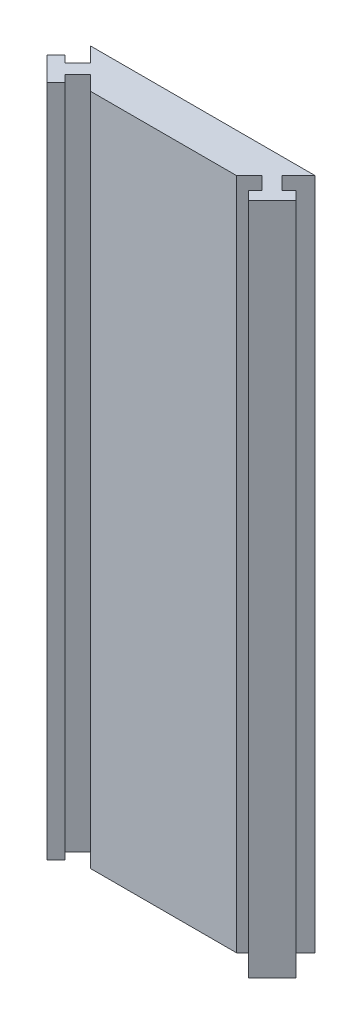
ISO-10303-21;
HEADER;
FILE_DESCRIPTION(('STEP AP214'),'2;1');
FILE_NAME('part.step','',(''),(''),'','','');
FILE_SCHEMA(('AUTOMOTIVE_DESIGN { 1 0 10303 214 1 1 1 1 }'));
ENDSEC;
DATA;
#1=APPLICATION_CONTEXT('core data for automotive mechanical design processes');
#2=APPLICATION_PROTOCOL_DEFINITION('international standard','automotive_design',2000,#1);
#3=PRODUCT_CONTEXT('',#1,'mechanical');
#4=PRODUCT('Part','Part','',(#3));
#5=PRODUCT_RELATED_PRODUCT_CATEGORY('part','',(#4));
#6=PRODUCT_DEFINITION_FORMATION('','',#4);
#7=PRODUCT_DEFINITION_CONTEXT('part definition',#1,'design');
#8=PRODUCT_DEFINITION('design','',#6,#7);
#9=PRODUCT_DEFINITION_SHAPE('','',#8);
#10=(LENGTH_UNIT() NAMED_UNIT(*) SI_UNIT(.MILLI.,.METRE.));
#11=(NAMED_UNIT(*) PLANE_ANGLE_UNIT() SI_UNIT($,.RADIAN.));
#12=(NAMED_UNIT(*) SI_UNIT($,.STERADIAN.) SOLID_ANGLE_UNIT());
#13=UNCERTAINTY_MEASURE_WITH_UNIT(LENGTH_MEASURE(1.E-05),#10,'distance_accuracy_value','');
#14=(GEOMETRIC_REPRESENTATION_CONTEXT(3) GLOBAL_UNCERTAINTY_ASSIGNED_CONTEXT((#13)) GLOBAL_UNIT_ASSIGNED_CONTEXT((#10,
#11,#12)) REPRESENTATION_CONTEXT('',''));
#15=CARTESIAN_POINT('',(0.,0.,0.));
#16=DIRECTION('',(0.,0.,1.));
#17=DIRECTION('',(1.,0.,0.));
#18=AXIS2_PLACEMENT_3D('',#15,#16,#17);
#19=CARTESIAN_POINT('',(-12.4677279807285,0.,10.0274908996884));
#20=DIRECTION('',(-0.707106781186551,0.,-0.707106781186544));
#21=DIRECTION('',(-0.707106781186544,0.,0.707106781186551));
#22=AXIS2_PLACEMENT_3D('',#19,#20,#21);
#23=PLANE('',#22);
#24=DIRECTION('',(0.,1.,0.));
#25=VECTOR('',#24,1.);
#26=CARTESIAN_POINT('',(-15.4046060400008,0.,12.9643689589607));
#27=LINE('',#26,#25);
#28=CARTESIAN_POINT('',(-15.4046060400008,0.,12.9643689589607));
#29=VERTEX_POINT('',#28);
#30=CARTESIAN_POINT('',(-15.4046060400008,120.,12.9643689589607));
#31=VERTEX_POINT('',#30);
#32=EDGE_CURVE('E267',#29,#31,#27,.T.);
#33=ORIENTED_EDGE('',*,*,#32,.F.);
#34=DIRECTION('',(-0.707106781186544,0.,0.707106781186551));
#35=VECTOR('',#34,1.);
#36=CARTESIAN_POINT('',(-12.4677279807285,0.,10.0274908996884));
#37=LINE('',#36,#35);
#38=CARTESIAN_POINT('',(-12.4677279807285,0.,10.0274908996884));
#39=VERTEX_POINT('',#38);
#40=EDGE_CURVE('E194',#39,#29,#37,.T.);
#41=ORIENTED_EDGE('',*,*,#40,.F.);
#42=DIRECTION('',(0.,-1.,0.));
#43=VECTOR('',#42,1.);
#44=CARTESIAN_POINT('',(-12.4677279807285,120.,10.0274908996884));
#45=LINE('',#44,#43);
#46=CARTESIAN_POINT('',(-12.4677279807285,120.,10.0274908996884));
#47=VERTEX_POINT('',#46);
#48=EDGE_CURVE('E11',#47,#39,#45,.T.);
#49=ORIENTED_EDGE('',*,*,#48,.F.);
#50=DIRECTION('',(-0.707106781186544,0.,0.707106781186551));
#51=VECTOR('',#50,1.);
#52=CARTESIAN_POINT('',(-12.4677279807285,120.,10.0274908996884));
#53=LINE('',#52,#51);
#54=EDGE_CURVE('E195',#47,#31,#53,.T.);
#55=ORIENTED_EDGE('',*,*,#54,.T.);
#56=EDGE_LOOP('',(#33,#41,#49,#55));
#57=FACE_BOUND('',#56,.T.);
#58=ADVANCED_FACE('F33',(#57),#23,.F.);
#59=CARTESIAN_POINT('',(-52.4677279807284,0.,10.0274908996884));
#60=DIRECTION('',(0.707106781186541,0.,-0.707106781186554));
#61=DIRECTION('',(-0.707106781186554,0.,-0.707106781186541));
#62=AXIS2_PLACEMENT_3D('',#59,#60,#61);
#63=PLANE('',#62);
#64=DIRECTION('',(0.,1.,0.));
#65=VECTOR('',#64,1.);
#66=CARTESIAN_POINT('',(-48.0483105983125,0.,14.4469082821042));
#67=LINE('',#66,#65);
#68=CARTESIAN_POINT('',(-48.0483105983125,0.,14.4469082821042));
#69=VERTEX_POINT('',#68);
#70=CARTESIAN_POINT('',(-48.0483105983125,120.,14.4469082821042));
#71=VERTEX_POINT('',#70);
#72=EDGE_CURVE('E281',#69,#71,#67,.T.);
#73=ORIENTED_EDGE('',*,*,#72,.F.);
#74=DIRECTION('',(-0.707106781186554,0.,-0.707106781186541));
#75=VECTOR('',#74,1.);
#76=CARTESIAN_POINT('',(-52.4677279807284,0.,10.0274908996884));
#77=LINE('',#76,#75);
#78=CARTESIAN_POINT('',(-45.4677279807283,0.,17.0274908996884));
#79=VERTEX_POINT('',#78);
#80=EDGE_CURVE('E206',#79,#69,#77,.T.);
#81=ORIENTED_EDGE('',*,*,#80,.F.);
#82=DIRECTION('',(0.,1.,0.));
#83=VECTOR('',#82,1.);
#84=CARTESIAN_POINT('',(-45.4677279807283,0.,17.0274908996884));
#85=LINE('',#84,#83);
#86=CARTESIAN_POINT('',(-45.4677279807283,120.,17.0274908996884));
#87=VERTEX_POINT('',#86);
#88=EDGE_CURVE('E209',#79,#87,#85,.T.);
#89=ORIENTED_EDGE('',*,*,#88,.T.);
#90=DIRECTION('',(-0.707106781186554,0.,-0.707106781186541));
#91=VECTOR('',#90,1.);
#92=CARTESIAN_POINT('',(-52.4677279807284,120.,10.0274908996884));
#93=LINE('',#92,#91);
#94=EDGE_CURVE('E211',#87,#71,#93,.T.);
#95=ORIENTED_EDGE('',*,*,#94,.T.);
#96=EDGE_LOOP('',(#73,#81,#89,#95));
#97=FACE_BOUND('',#96,.T.);
#98=ADVANCED_FACE('F372',(#97),#63,.F.);
#99=CARTESIAN_POINT('',(-52.4677279807284,120.,17.0274908996884));
#100=DIRECTION('',(0.,0.,-1.));
#101=DIRECTION('',(-1.,0.,0.));
#102=AXIS2_PLACEMENT_3D('',#99,#100,#101);
#103=PLANE('',#102);
#104=DIRECTION('',(1.,0.,0.));
#105=VECTOR('',#104,1.);
#106=CARTESIAN_POINT('',(-52.4677279807284,0.,17.0274908996884));
#107=LINE('',#106,#105);
#108=CARTESIAN_POINT('',(-19.4677279807284,0.,17.0274908996884));
#109=VERTEX_POINT('',#108);
#110=EDGE_CURVE('E215',#79,#109,#107,.T.);
#111=ORIENTED_EDGE('',*,*,#110,.T.);
#112=DIRECTION('',(0.,1.,0.));
#113=VECTOR('',#112,1.);
#114=CARTESIAN_POINT('',(-19.4677279807284,0.,17.0274908996884));
#115=LINE('',#114,#113);
#116=CARTESIAN_POINT('',(-19.4677279807284,120.,17.0274908996884));
#117=VERTEX_POINT('',#116);
#118=EDGE_CURVE('E192',#109,#117,#115,.T.);
#119=ORIENTED_EDGE('',*,*,#118,.T.);
#120=DIRECTION('',(1.,0.,0.));
#121=VECTOR('',#120,1.);
#122=CARTESIAN_POINT('',(-52.4677279807284,120.,17.0274908996884));
#123=LINE('',#122,#121);
#124=EDGE_CURVE('E216',#87,#117,#123,.T.);
#125=ORIENTED_EDGE('',*,*,#124,.F.);
#126=ORIENTED_EDGE('',*,*,#88,.F.);
#127=EDGE_LOOP('',(#111,#119,#125,#126));
#128=FACE_BOUND('',#127,.T.);
#129=ADVANCED_FACE('F35',(#128),#103,.F.);
#130=CARTESIAN_POINT('',(-52.4677279807284,120.,10.0274908996884));
#131=DIRECTION('',(0.,0.,1.));
#132=DIRECTION('',(1.,0.,0.));
#133=AXIS2_PLACEMENT_3D('',#130,#131,#132);
#134=PLANE('',#133);
#135=DIRECTION('',(-1.,0.,0.));
#136=VECTOR('',#135,1.);
#137=CARTESIAN_POINT('',(-52.4677279807284,0.,10.0274908996884));
#138=LINE('',#137,#136);
#139=CARTESIAN_POINT('',(-52.4677279807284,0.,10.0274908996884));
#140=VERTEX_POINT('',#139);
#141=EDGE_CURVE('E220',#39,#140,#138,.T.);
#142=ORIENTED_EDGE('',*,*,#141,.T.);
#143=DIRECTION('',(0.,-1.,0.));
#144=VECTOR('',#143,1.);
#145=CARTESIAN_POINT('',(-52.4677279807284,120.,10.0274908996884));
#146=LINE('',#145,#144);
#147=CARTESIAN_POINT('',(-52.4677279807284,120.,10.0274908996884));
#148=VERTEX_POINT('',#147);
#149=EDGE_CURVE('E41',#148,#140,#146,.T.);
#150=ORIENTED_EDGE('',*,*,#149,.F.);
#151=DIRECTION('',(-1.,0.,0.));
#152=VECTOR('',#151,1.);
#153=CARTESIAN_POINT('',(-52.4677279807284,120.,10.0274908996884));
#154=LINE('',#153,#152);
#155=EDGE_CURVE('E219',#47,#148,#154,.T.);
#156=ORIENTED_EDGE('',*,*,#155,.F.);
#157=ORIENTED_EDGE('',*,*,#48,.T.);
#158=EDGE_LOOP('',(#142,#150,#156,#157));
#159=FACE_BOUND('',#158,.T.);
#160=ADVANCED_FACE('F234',(#159),#134,.F.);
#161=CARTESIAN_POINT('',(0.,120.,0.));
#162=DIRECTION('',(0.,-1.,0.));
#163=DIRECTION('',(0.,0.,-1.));
#164=AXIS2_PLACEMENT_3D('',#161,#162,#163);
#165=PLANE('',#164);
#166=ORIENTED_EDGE('',*,*,#124,.T.);
#167=CARTESIAN_POINT('',(-17.1723729929671,120.,14.7321359119271));
#168=VERTEX_POINT('',#167);
#169=EDGE_CURVE('E198',#168,#117,#53,.T.);
#170=ORIENTED_EDGE('',*,*,#169,.F.);
#171=DIRECTION('',(0.707106781186548,0.,0.707106781186547));
#172=VECTOR('',#171,1.);
#173=CARTESIAN_POINT('',(-17.1723729929671,120.,14.7321359119271));
#174=LINE('',#173,#172);
#175=CARTESIAN_POINT('',(-14.8742759541108,120.,17.0302329507833));
#176=VERTEX_POINT('',#175);
#177=EDGE_CURVE('E48',#168,#176,#174,.T.);
#178=ORIENTED_EDGE('',*,*,#177,.T.);
#179=DIRECTION('',(-0.707106781186546,0.,0.707106781186549));
#180=VECTOR('',#179,1.);
#181=CARTESIAN_POINT('',(-14.8742759541108,120.,17.0302329507833));
#182=LINE('',#181,#180);
#183=CARTESIAN_POINT('',(-16.1117128211873,120.,18.2676698178598));
#184=VERTEX_POINT('',#183);
#185=EDGE_CURVE('E319',#176,#184,#182,.T.);
#186=ORIENTED_EDGE('',*,*,#185,.T.);
#187=DIRECTION('',(0.707106781186548,0.,0.707106781186547));
#188=VECTOR('',#187,1.);
#189=CARTESIAN_POINT('',(-16.1117128211873,120.,18.2676698178598));
#190=LINE('',#189,#188);
#191=CARTESIAN_POINT('',(-14.5207225635176,120.,19.8586600755295));
#192=VERTEX_POINT('',#191);
#193=EDGE_CURVE('E323',#184,#192,#190,.T.);
#194=ORIENTED_EDGE('',*,*,#193,.T.);
#195=DIRECTION('',(0.707106781186548,0.,-0.707106781186547));
#196=VECTOR('',#195,1.);
#197=CARTESIAN_POINT('',(-14.5207225635176,120.,19.8586600755295));
#198=LINE('',#197,#196);
#199=CARTESIAN_POINT('',(-10.2780818763983,120.,15.6160193884102));
#200=VERTEX_POINT('',#199);
#201=EDGE_CURVE('E330',#192,#200,#198,.T.);
#202=ORIENTED_EDGE('',*,*,#201,.T.);
#203=DIRECTION('',(-0.707106781186548,0.,-0.707106781186548));
#204=VECTOR('',#203,1.);
#205=CARTESIAN_POINT('',(-10.2780818763983,120.,15.6160193884102));
#206=LINE('',#205,#204);
#207=CARTESIAN_POINT('',(-11.869072134068,120.,14.0250291307405));
#208=VERTEX_POINT('',#207);
#209=EDGE_CURVE('E333',#200,#208,#206,.T.);
#210=ORIENTED_EDGE('',*,*,#209,.T.);
#211=DIRECTION('',(-0.707106781186547,0.,0.707106781186548));
#212=VECTOR('',#211,1.);
#213=CARTESIAN_POINT('',(-11.869072134068,120.,14.0250291307405));
#214=LINE('',#213,#212);
#215=CARTESIAN_POINT('',(-13.1065090011445,120.,15.2624659978169));
#216=VERTEX_POINT('',#215);
#217=EDGE_CURVE('E335',#208,#216,#214,.T.);
#218=ORIENTED_EDGE('',*,*,#217,.T.);
#219=DIRECTION('',(-0.707106781186547,0.,-0.707106781186547));
#220=VECTOR('',#219,1.);
#221=CARTESIAN_POINT('',(-13.1065090011445,120.,15.2624659978169));
#222=LINE('',#221,#220);
#223=EDGE_CURVE('E188',#216,#31,#222,.T.);
#224=ORIENTED_EDGE('',*,*,#223,.T.);
#225=ORIENTED_EDGE('',*,*,#54,.F.);
#226=ORIENTED_EDGE('',*,*,#155,.T.);
#227=CARTESIAN_POINT('',(-49.8160775512789,120.,12.6791413291379));
#228=VERTEX_POINT('',#227);
#229=EDGE_CURVE('E205',#228,#148,#93,.T.);
#230=ORIENTED_EDGE('',*,*,#229,.F.);
#231=DIRECTION('',(-0.707106781186548,0.,0.707106781186547));
#232=VECTOR('',#231,1.);
#233=CARTESIAN_POINT('',(-49.8160775512788,120.,12.6791413291379));
#234=LINE('',#233,#232);
#235=CARTESIAN_POINT('',(-52.1141745901351,120.,14.9772383679941));
#236=VERTEX_POINT('',#235);
#237=EDGE_CURVE('E56',#228,#236,#234,.T.);
#238=ORIENTED_EDGE('',*,*,#237,.T.);
#239=DIRECTION('',(-0.707106781186549,0.,-0.707106781186547));
#240=VECTOR('',#239,1.);
#241=CARTESIAN_POINT('',(-52.1141745901351,120.,14.9772383679941));
#242=LINE('',#241,#240);
#243=CARTESIAN_POINT('',(-53.3516114572116,120.,13.7398015009177));
#244=VERTEX_POINT('',#243);
#245=EDGE_CURVE('E266',#236,#244,#242,.T.);
#246=ORIENTED_EDGE('',*,*,#245,.T.);
#247=DIRECTION('',(-0.707106781186548,0.,0.707106781186547));
#248=VECTOR('',#247,1.);
#249=CARTESIAN_POINT('',(-53.3516114572116,120.,13.7398015009177));
#250=LINE('',#249,#248);
#251=CARTESIAN_POINT('',(-54.9426017148813,120.,15.3307917585874));
#252=VERTEX_POINT('',#251);
#253=EDGE_CURVE('E270',#244,#252,#250,.T.);
#254=ORIENTED_EDGE('',*,*,#253,.T.);
#255=DIRECTION('',(0.707106781186548,0.,0.707106781186548));
#256=VECTOR('',#255,1.);
#257=CARTESIAN_POINT('',(-54.9426017148813,120.,15.3307917585874));
#258=LINE('',#257,#256);
#259=CARTESIAN_POINT('',(-50.699961027762,120.,19.5734324457067));
#260=VERTEX_POINT('',#259);
#261=EDGE_CURVE('E273',#252,#260,#258,.T.);
#262=ORIENTED_EDGE('',*,*,#261,.T.);
#263=DIRECTION('',(0.707106781186545,0.,-0.70710678118655));
#264=VECTOR('',#263,1.);
#265=CARTESIAN_POINT('',(-50.699961027762,120.,19.5734324457067));
#266=LINE('',#265,#264);
#267=CARTESIAN_POINT('',(-49.1089707700923,120.,17.9824421880369));
#268=VERTEX_POINT('',#267);
#269=EDGE_CURVE('E276',#260,#268,#266,.T.);
#270=ORIENTED_EDGE('',*,*,#269,.T.);
#271=DIRECTION('',(-0.707106781186549,0.,-0.707106781186545));
#272=VECTOR('',#271,1.);
#273=CARTESIAN_POINT('',(-49.1089707700923,120.,17.9824421880369));
#274=LINE('',#273,#272);
#275=CARTESIAN_POINT('',(-50.3464076371687,120.,16.7450053209605));
#276=VERTEX_POINT('',#275);
#277=EDGE_CURVE('E248',#268,#276,#274,.T.);
#278=ORIENTED_EDGE('',*,*,#277,.T.);
#279=DIRECTION('',(0.707106781186548,0.,-0.707106781186547));
#280=VECTOR('',#279,1.);
#281=CARTESIAN_POINT('',(-50.3464076371687,120.,16.7450053209605));
#282=LINE('',#281,#280);
#283=EDGE_CURVE('E243',#276,#71,#282,.T.);
#284=ORIENTED_EDGE('',*,*,#283,.T.);
#285=ORIENTED_EDGE('',*,*,#94,.F.);
#286=EDGE_LOOP('',(#166,#170,#178,#186,#194,#202,#210,#218,#224,#225,#226,#230,#238,#246,#254,
#262,#270,#278,#284,#285));
#287=FACE_BOUND('',#286,.T.);
#288=ADVANCED_FACE('F295',(#287),#165,.F.);
#289=CARTESIAN_POINT('',(0.,0.,0.));
#290=DIRECTION('',(0.,-1.,0.));
#291=DIRECTION('',(0.,0.,-1.));
#292=AXIS2_PLACEMENT_3D('',#289,#290,#291);
#293=PLANE('',#292);
#294=ORIENTED_EDGE('',*,*,#40,.T.);
#295=DIRECTION('',(-0.707106781186547,0.,-0.707106781186547));
#296=VECTOR('',#295,1.);
#297=CARTESIAN_POINT('',(-13.1065090011445,0.,15.2624659978169));
#298=LINE('',#297,#296);
#299=CARTESIAN_POINT('',(-13.1065090011445,0.,15.2624659978169));
#300=VERTEX_POINT('',#299);
#301=EDGE_CURVE('E176',#300,#29,#298,.T.);
#302=ORIENTED_EDGE('',*,*,#301,.F.);
#303=DIRECTION('',(-0.707106781186547,0.,0.707106781186548));
#304=VECTOR('',#303,1.);
#305=CARTESIAN_POINT('',(-11.869072134068,0.,14.0250291307405));
#306=LINE('',#305,#304);
#307=CARTESIAN_POINT('',(-11.869072134068,0.,14.0250291307405));
#308=VERTEX_POINT('',#307);
#309=EDGE_CURVE('E342',#308,#300,#306,.T.);
#310=ORIENTED_EDGE('',*,*,#309,.F.);
#311=DIRECTION('',(-0.707106781186548,0.,-0.707106781186548));
#312=VECTOR('',#311,1.);
#313=CARTESIAN_POINT('',(-10.2780818763983,0.,15.6160193884102));
#314=LINE('',#313,#312);
#315=CARTESIAN_POINT('',(-10.2780818763983,0.,15.6160193884102));
#316=VERTEX_POINT('',#315);
#317=EDGE_CURVE('E346',#316,#308,#314,.T.);
#318=ORIENTED_EDGE('',*,*,#317,.F.);
#319=DIRECTION('',(0.707106781186548,0.,-0.707106781186547));
#320=VECTOR('',#319,1.);
#321=CARTESIAN_POINT('',(-14.5207225635176,0.,19.8586600755295));
#322=LINE('',#321,#320);
#323=CARTESIAN_POINT('',(-14.5207225635176,0.,19.8586600755295));
#324=VERTEX_POINT('',#323);
#325=EDGE_CURVE('E347',#324,#316,#322,.T.);
#326=ORIENTED_EDGE('',*,*,#325,.F.);
#327=DIRECTION('',(0.707106781186548,0.,0.707106781186547));
#328=VECTOR('',#327,1.);
#329=CARTESIAN_POINT('',(-16.1117128211873,0.,18.2676698178598));
#330=LINE('',#329,#328);
#331=CARTESIAN_POINT('',(-16.1117128211873,0.,18.2676698178598));
#332=VERTEX_POINT('',#331);
#333=EDGE_CURVE('E352',#332,#324,#330,.T.);
#334=ORIENTED_EDGE('',*,*,#333,.F.);
#335=DIRECTION('',(-0.707106781186546,0.,0.707106781186549));
#336=VECTOR('',#335,1.);
#337=CARTESIAN_POINT('',(-14.8742759541108,0.,17.0302329507833));
#338=LINE('',#337,#336);
#339=CARTESIAN_POINT('',(-14.8742759541108,0.,17.0302329507833));
#340=VERTEX_POINT('',#339);
#341=EDGE_CURVE('E187',#340,#332,#338,.T.);
#342=ORIENTED_EDGE('',*,*,#341,.F.);
#343=DIRECTION('',(0.707106781186548,0.,0.707106781186547));
#344=VECTOR('',#343,1.);
#345=CARTESIAN_POINT('',(-17.1723729929671,0.,14.7321359119271));
#346=LINE('',#345,#344);
#347=CARTESIAN_POINT('',(-17.1723729929671,0.,14.7321359119271));
#348=VERTEX_POINT('',#347);
#349=EDGE_CURVE('E171',#348,#340,#346,.T.);
#350=ORIENTED_EDGE('',*,*,#349,.F.);
#351=EDGE_CURVE('E183',#348,#109,#37,.T.);
#352=ORIENTED_EDGE('',*,*,#351,.T.);
#353=ORIENTED_EDGE('',*,*,#110,.F.);
#354=ORIENTED_EDGE('',*,*,#80,.T.);
#355=DIRECTION('',(0.707106781186548,0.,-0.707106781186547));
#356=VECTOR('',#355,1.);
#357=CARTESIAN_POINT('',(-50.3464076371687,0.,16.7450053209605));
#358=LINE('',#357,#356);
#359=CARTESIAN_POINT('',(-50.3464076371687,0.,16.7450053209605));
#360=VERTEX_POINT('',#359);
#361=EDGE_CURVE('E263',#360,#69,#358,.T.);
#362=ORIENTED_EDGE('',*,*,#361,.F.);
#363=DIRECTION('',(-0.707106781186549,0.,-0.707106781186545));
#364=VECTOR('',#363,1.);
#365=CARTESIAN_POINT('',(-49.1089707700923,0.,17.9824421880369));
#366=LINE('',#365,#364);
#367=CARTESIAN_POINT('',(-49.1089707700923,0.,17.9824421880369));
#368=VERTEX_POINT('',#367);
#369=EDGE_CURVE('E260',#368,#360,#366,.T.);
#370=ORIENTED_EDGE('',*,*,#369,.F.);
#371=DIRECTION('',(0.707106781186545,0.,-0.70710678118655));
#372=VECTOR('',#371,1.);
#373=CARTESIAN_POINT('',(-50.699961027762,0.,19.5734324457067));
#374=LINE('',#373,#372);
#375=CARTESIAN_POINT('',(-50.699961027762,0.,19.5734324457067));
#376=VERTEX_POINT('',#375);
#377=EDGE_CURVE('E257',#376,#368,#374,.T.);
#378=ORIENTED_EDGE('',*,*,#377,.F.);
#379=DIRECTION('',(0.707106781186548,0.,0.707106781186548));
#380=VECTOR('',#379,1.);
#381=CARTESIAN_POINT('',(-54.9426017148813,0.,15.3307917585874));
#382=LINE('',#381,#380);
#383=CARTESIAN_POINT('',(-54.9426017148813,0.,15.3307917585874));
#384=VERTEX_POINT('',#383);
#385=EDGE_CURVE('E254',#384,#376,#382,.T.);
#386=ORIENTED_EDGE('',*,*,#385,.F.);
#387=DIRECTION('',(-0.707106781186548,0.,0.707106781186547));
#388=VECTOR('',#387,1.);
#389=CARTESIAN_POINT('',(-53.3516114572116,0.,13.7398015009177));
#390=LINE('',#389,#388);
#391=CARTESIAN_POINT('',(-53.3516114572116,0.,13.7398015009177));
#392=VERTEX_POINT('',#391);
#393=EDGE_CURVE('E245',#392,#384,#390,.T.);
#394=ORIENTED_EDGE('',*,*,#393,.F.);
#395=DIRECTION('',(-0.707106781186549,0.,-0.707106781186547));
#396=VECTOR('',#395,1.);
#397=CARTESIAN_POINT('',(-52.1141745901351,0.,14.9772383679941));
#398=LINE('',#397,#396);
#399=CARTESIAN_POINT('',(-52.1141745901351,0.,14.9772383679941));
#400=VERTEX_POINT('',#399);
#401=EDGE_CURVE('E242',#400,#392,#398,.T.);
#402=ORIENTED_EDGE('',*,*,#401,.F.);
#403=DIRECTION('',(-0.707106781186548,0.,0.707106781186547));
#404=VECTOR('',#403,1.);
#405=CARTESIAN_POINT('',(-49.8160775512788,0.,12.6791413291379));
#406=LINE('',#405,#404);
#407=CARTESIAN_POINT('',(-49.8160775512788,0.,12.6791413291379));
#408=VERTEX_POINT('',#407);
#409=EDGE_CURVE('E239',#408,#400,#406,.T.);
#410=ORIENTED_EDGE('',*,*,#409,.F.);
#411=EDGE_CURVE('E210',#408,#140,#77,.T.);
#412=ORIENTED_EDGE('',*,*,#411,.T.);
#413=ORIENTED_EDGE('',*,*,#141,.F.);
#414=EDGE_LOOP('',(#294,#302,#310,#318,#326,#334,#342,#350,#352,#353,#354,#362,#370,#378,#386,
#394,#402,#410,#412,#413));
#415=FACE_BOUND('',#414,.T.);
#416=ADVANCED_FACE('F181',(#415),#293,.T.);
#417=ORIENTED_EDGE('',*,*,#411,.F.);
#418=DIRECTION('',(0.,1.,0.));
#419=VECTOR('',#418,1.);
#420=CARTESIAN_POINT('',(-49.8160775512788,0.,12.6791413291379));
#421=LINE('',#420,#419);
#422=EDGE_CURVE('E201',#408,#228,#421,.T.);
#423=ORIENTED_EDGE('',*,*,#422,.T.);
#424=ORIENTED_EDGE('',*,*,#229,.T.);
#425=ORIENTED_EDGE('',*,*,#149,.T.);
#426=EDGE_LOOP('',(#417,#423,#424,#425));
#427=FACE_BOUND('',#426,.T.);
#428=ADVANCED_FACE('F229',(#427),#63,.F.);
#429=ORIENTED_EDGE('',*,*,#351,.F.);
#430=DIRECTION('',(0.,1.,0.));
#431=VECTOR('',#430,1.);
#432=CARTESIAN_POINT('',(-17.1723729929671,0.,14.7321359119271));
#433=LINE('',#432,#431);
#434=EDGE_CURVE('E168',#348,#168,#433,.T.);
#435=ORIENTED_EDGE('',*,*,#434,.T.);
#436=ORIENTED_EDGE('',*,*,#169,.T.);
#437=ORIENTED_EDGE('',*,*,#118,.F.);
#438=EDGE_LOOP('',(#429,#435,#436,#437));
#439=FACE_BOUND('',#438,.T.);
#440=ADVANCED_FACE('F190',(#439),#23,.F.);
#441=CARTESIAN_POINT('',(-50.3464076371687,0.,16.7450053209605));
#442=DIRECTION('',(0.707106781186547,0.,0.707106781186548));
#443=DIRECTION('',(0.707106781186548,0.,-0.707106781186547));
#444=AXIS2_PLACEMENT_3D('',#441,#442,#443);
#445=PLANE('',#444);
#446=ORIENTED_EDGE('',*,*,#283,.F.);
#447=DIRECTION('',(0.,1.,0.));
#448=VECTOR('',#447,1.);
#449=CARTESIAN_POINT('',(-50.3464076371687,0.,16.7450053209605));
#450=LINE('',#449,#448);
#451=EDGE_CURVE('E283',#360,#276,#450,.T.);
#452=ORIENTED_EDGE('',*,*,#451,.F.);
#453=ORIENTED_EDGE('',*,*,#361,.T.);
#454=ORIENTED_EDGE('',*,*,#72,.T.);
#455=EDGE_LOOP('',(#446,#452,#453,#454));
#456=FACE_BOUND('',#455,.T.);
#457=ADVANCED_FACE('F381',(#456),#445,.T.);
#458=CARTESIAN_POINT('',(-49.1089707700923,0.,17.9824421880369));
#459=DIRECTION('',(0.707106781186546,0.,-0.707106781186549));
#460=DIRECTION('',(-0.707106781186549,0.,-0.707106781186546));
#461=AXIS2_PLACEMENT_3D('',#458,#459,#460);
#462=PLANE('',#461);
#463=ORIENTED_EDGE('',*,*,#277,.F.);
#464=DIRECTION('',(0.,1.,0.));
#465=VECTOR('',#464,1.);
#466=CARTESIAN_POINT('',(-49.1089707700923,0.,17.9824421880369));
#467=LINE('',#466,#465);
#468=EDGE_CURVE('E285',#368,#268,#467,.T.);
#469=ORIENTED_EDGE('',*,*,#468,.F.);
#470=ORIENTED_EDGE('',*,*,#369,.T.);
#471=ORIENTED_EDGE('',*,*,#451,.T.);
#472=EDGE_LOOP('',(#463,#469,#470,#471));
#473=FACE_BOUND('',#472,.T.);
#474=ADVANCED_FACE('F386',(#473),#462,.T.);
#475=CARTESIAN_POINT('',(-50.699961027762,0.,19.5734324457067));
#476=DIRECTION('',(0.70710678118655,0.,0.707106781186545));
#477=DIRECTION('',(0.707106781186545,0.,-0.70710678118655));
#478=AXIS2_PLACEMENT_3D('',#475,#476,#477);
#479=PLANE('',#478);
#480=ORIENTED_EDGE('',*,*,#269,.F.);
#481=DIRECTION('',(0.,1.,0.));
#482=VECTOR('',#481,1.);
#483=CARTESIAN_POINT('',(-50.699961027762,0.,19.5734324457067));
#484=LINE('',#483,#482);
#485=EDGE_CURVE('E287',#376,#260,#484,.T.);
#486=ORIENTED_EDGE('',*,*,#485,.F.);
#487=ORIENTED_EDGE('',*,*,#377,.T.);
#488=ORIENTED_EDGE('',*,*,#468,.T.);
#489=EDGE_LOOP('',(#480,#486,#487,#488));
#490=FACE_BOUND('',#489,.T.);
#491=ADVANCED_FACE('F415',(#490),#479,.T.);
#492=CARTESIAN_POINT('',(-54.9426017148813,0.,15.3307917585874));
#493=DIRECTION('',(-0.707106781186547,0.,0.707106781186547));
#494=DIRECTION('',(0.707106781186548,0.,0.707106781186548));
#495=AXIS2_PLACEMENT_3D('',#492,#493,#494);
#496=PLANE('',#495);
#497=ORIENTED_EDGE('',*,*,#261,.F.);
#498=DIRECTION('',(0.,1.,0.));
#499=VECTOR('',#498,1.);
#500=CARTESIAN_POINT('',(-54.9426017148813,0.,15.3307917585874));
#501=LINE('',#500,#499);
#502=EDGE_CURVE('E289',#384,#252,#501,.T.);
#503=ORIENTED_EDGE('',*,*,#502,.F.);
#504=ORIENTED_EDGE('',*,*,#385,.T.);
#505=ORIENTED_EDGE('',*,*,#485,.T.);
#506=EDGE_LOOP('',(#497,#503,#504,#505));
#507=FACE_BOUND('',#506,.T.);
#508=ADVANCED_FACE('F418',(#507),#496,.T.);
#509=CARTESIAN_POINT('',(-53.3516114572116,0.,13.7398015009177));
#510=DIRECTION('',(-0.707106781186547,0.,-0.707106781186548));
#511=DIRECTION('',(-0.707106781186548,0.,0.707106781186547));
#512=AXIS2_PLACEMENT_3D('',#509,#510,#511);
#513=PLANE('',#512);
#514=ORIENTED_EDGE('',*,*,#253,.F.);
#515=DIRECTION('',(0.,1.,0.));
#516=VECTOR('',#515,1.);
#517=CARTESIAN_POINT('',(-53.3516114572116,0.,13.7398015009177));
#518=LINE('',#517,#516);
#519=EDGE_CURVE('E291',#392,#244,#518,.T.);
#520=ORIENTED_EDGE('',*,*,#519,.F.);
#521=ORIENTED_EDGE('',*,*,#393,.T.);
#522=ORIENTED_EDGE('',*,*,#502,.T.);
#523=EDGE_LOOP('',(#514,#520,#521,#522));
#524=FACE_BOUND('',#523,.T.);
#525=ADVANCED_FACE('F421',(#524),#513,.T.);
#526=CARTESIAN_POINT('',(-52.1141745901351,0.,14.9772383679941));
#527=DIRECTION('',(0.707106781186547,0.,-0.707106781186549));
#528=DIRECTION('',(-0.707106781186549,0.,-0.707106781186547));
#529=AXIS2_PLACEMENT_3D('',#526,#527,#528);
#530=PLANE('',#529);
#531=ORIENTED_EDGE('',*,*,#245,.F.);
#532=DIRECTION('',(0.,1.,0.));
#533=VECTOR('',#532,1.);
#534=CARTESIAN_POINT('',(-52.1141745901351,0.,14.9772383679941));
#535=LINE('',#534,#533);
#536=EDGE_CURVE('E292',#400,#236,#535,.T.);
#537=ORIENTED_EDGE('',*,*,#536,.F.);
#538=ORIENTED_EDGE('',*,*,#401,.T.);
#539=ORIENTED_EDGE('',*,*,#519,.T.);
#540=EDGE_LOOP('',(#531,#537,#538,#539));
#541=FACE_BOUND('',#540,.T.);
#542=ADVANCED_FACE('F423',(#541),#530,.T.);
#543=CARTESIAN_POINT('',(-49.8160775512788,0.,12.6791413291379));
#544=DIRECTION('',(-0.707106781186547,0.,-0.707106781186548));
#545=DIRECTION('',(-0.707106781186548,0.,0.707106781186547));
#546=AXIS2_PLACEMENT_3D('',#543,#544,#545);
#547=PLANE('',#546);
#548=ORIENTED_EDGE('',*,*,#237,.F.);
#549=ORIENTED_EDGE('',*,*,#422,.F.);
#550=ORIENTED_EDGE('',*,*,#409,.T.);
#551=ORIENTED_EDGE('',*,*,#536,.T.);
#552=EDGE_LOOP('',(#548,#549,#550,#551));
#553=FACE_BOUND('',#552,.T.);
#554=ADVANCED_FACE('F425',(#553),#547,.T.);
#555=CARTESIAN_POINT('',(-13.1065090011445,0.,15.2624659978169));
#556=DIRECTION('',(0.707106781186547,0.,-0.707106781186547));
#557=DIRECTION('',(-0.707106781186548,0.,-0.707106781186548));
#558=AXIS2_PLACEMENT_3D('',#555,#556,#557);
#559=PLANE('',#558);
#560=ORIENTED_EDGE('',*,*,#223,.F.);
#561=DIRECTION('',(0.,1.,0.));
#562=VECTOR('',#561,1.);
#563=CARTESIAN_POINT('',(-13.1065090011445,0.,15.2624659978169));
#564=LINE('',#563,#562);
#565=EDGE_CURVE('E303',#300,#216,#564,.T.);
#566=ORIENTED_EDGE('',*,*,#565,.F.);
#567=ORIENTED_EDGE('',*,*,#301,.T.);
#568=ORIENTED_EDGE('',*,*,#32,.T.);
#569=EDGE_LOOP('',(#560,#566,#567,#568));
#570=FACE_BOUND('',#569,.T.);
#571=ADVANCED_FACE('F339',(#570),#559,.T.);
#572=CARTESIAN_POINT('',(-11.869072134068,0.,14.0250291307405));
#573=DIRECTION('',(-0.707106781186548,0.,-0.707106781186547));
#574=DIRECTION('',(-0.707106781186547,0.,0.707106781186548));
#575=AXIS2_PLACEMENT_3D('',#572,#573,#574);
#576=PLANE('',#575);
#577=ORIENTED_EDGE('',*,*,#217,.F.);
#578=DIRECTION('',(0.,1.,0.));
#579=VECTOR('',#578,1.);
#580=CARTESIAN_POINT('',(-11.869072134068,0.,14.0250291307405));
#581=LINE('',#580,#579);
#582=EDGE_CURVE('E305',#308,#208,#581,.T.);
#583=ORIENTED_EDGE('',*,*,#582,.F.);
#584=ORIENTED_EDGE('',*,*,#309,.T.);
#585=ORIENTED_EDGE('',*,*,#565,.T.);
#586=EDGE_LOOP('',(#577,#583,#584,#585));
#587=FACE_BOUND('',#586,.T.);
#588=ADVANCED_FACE('F343',(#587),#576,.T.);
#589=CARTESIAN_POINT('',(-10.2780818763983,0.,15.6160193884102));
#590=DIRECTION('',(0.707106781186547,0.,-0.707106781186547));
#591=DIRECTION('',(-0.707106781186548,0.,-0.707106781186548));
#592=AXIS2_PLACEMENT_3D('',#589,#590,#591);
#593=PLANE('',#592);
#594=ORIENTED_EDGE('',*,*,#209,.F.);
#595=DIRECTION('',(0.,1.,0.));
#596=VECTOR('',#595,1.);
#597=CARTESIAN_POINT('',(-10.2780818763983,0.,15.6160193884102));
#598=LINE('',#597,#596);
#599=EDGE_CURVE('E311',#316,#200,#598,.T.);
#600=ORIENTED_EDGE('',*,*,#599,.F.);
#601=ORIENTED_EDGE('',*,*,#317,.T.);
#602=ORIENTED_EDGE('',*,*,#582,.T.);
#603=EDGE_LOOP('',(#594,#600,#601,#602));
#604=FACE_BOUND('',#603,.T.);
#605=ADVANCED_FACE('F362',(#604),#593,.T.);
#606=CARTESIAN_POINT('',(-14.5207225635176,0.,19.8586600755295));
#607=DIRECTION('',(0.707106781186547,0.,0.707106781186548));
#608=DIRECTION('',(0.707106781186548,0.,-0.707106781186547));
#609=AXIS2_PLACEMENT_3D('',#606,#607,#608);
#610=PLANE('',#609);
#611=ORIENTED_EDGE('',*,*,#201,.F.);
#612=DIRECTION('',(0.,1.,0.));
#613=VECTOR('',#612,1.);
#614=CARTESIAN_POINT('',(-14.5207225635176,0.,19.8586600755295));
#615=LINE('',#614,#613);
#616=EDGE_CURVE('E313',#324,#192,#615,.T.);
#617=ORIENTED_EDGE('',*,*,#616,.F.);
#618=ORIENTED_EDGE('',*,*,#325,.T.);
#619=ORIENTED_EDGE('',*,*,#599,.T.);
#620=EDGE_LOOP('',(#611,#617,#618,#619));
#621=FACE_BOUND('',#620,.T.);
#622=ADVANCED_FACE('F360',(#621),#610,.T.);
#623=CARTESIAN_POINT('',(-16.1117128211873,0.,18.2676698178598));
#624=DIRECTION('',(-0.707106781186547,0.,0.707106781186548));
#625=DIRECTION('',(0.707106781186548,0.,0.707106781186547));
#626=AXIS2_PLACEMENT_3D('',#623,#624,#625);
#627=PLANE('',#626);
#628=ORIENTED_EDGE('',*,*,#193,.F.);
#629=DIRECTION('',(0.,1.,0.));
#630=VECTOR('',#629,1.);
#631=CARTESIAN_POINT('',(-16.1117128211873,0.,18.2676698178598));
#632=LINE('',#631,#630);
#633=EDGE_CURVE('E315',#332,#184,#632,.T.);
#634=ORIENTED_EDGE('',*,*,#633,.F.);
#635=ORIENTED_EDGE('',*,*,#333,.T.);
#636=ORIENTED_EDGE('',*,*,#616,.T.);
#637=EDGE_LOOP('',(#628,#634,#635,#636));
#638=FACE_BOUND('',#637,.T.);
#639=ADVANCED_FACE('F356',(#638),#627,.T.);
#640=CARTESIAN_POINT('',(-14.8742759541108,0.,17.0302329507833));
#641=DIRECTION('',(-0.707106781186549,0.,-0.707106781186546));
#642=DIRECTION('',(-0.707106781186546,0.,0.707106781186549));
#643=AXIS2_PLACEMENT_3D('',#640,#641,#642);
#644=PLANE('',#643);
#645=ORIENTED_EDGE('',*,*,#185,.F.);
#646=DIRECTION('',(0.,1.,0.));
#647=VECTOR('',#646,1.);
#648=CARTESIAN_POINT('',(-14.8742759541108,0.,17.0302329507833));
#649=LINE('',#648,#647);
#650=EDGE_CURVE('E175',#340,#176,#649,.T.);
#651=ORIENTED_EDGE('',*,*,#650,.F.);
#652=ORIENTED_EDGE('',*,*,#341,.T.);
#653=ORIENTED_EDGE('',*,*,#633,.T.);
#654=EDGE_LOOP('',(#645,#651,#652,#653));
#655=FACE_BOUND('',#654,.T.);
#656=ADVANCED_FACE('F320',(#655),#644,.T.);
#657=CARTESIAN_POINT('',(-17.1723729929671,0.,14.7321359119271));
#658=DIRECTION('',(-0.707106781186547,0.,0.707106781186548));
#659=DIRECTION('',(0.707106781186548,0.,0.707106781186547));
#660=AXIS2_PLACEMENT_3D('',#657,#658,#659);
#661=PLANE('',#660);
#662=ORIENTED_EDGE('',*,*,#177,.F.);
#663=ORIENTED_EDGE('',*,*,#434,.F.);
#664=ORIENTED_EDGE('',*,*,#349,.T.);
#665=ORIENTED_EDGE('',*,*,#650,.T.);
#666=EDGE_LOOP('',(#662,#663,#664,#665));
#667=FACE_BOUND('',#666,.T.);
#668=ADVANCED_FACE('F170',(#667),#661,.T.);
#669=CLOSED_SHELL('',(#58,#98,#129,#160,#288,#416,#428,#440,#457,#474,#491,#508,#525,#542,#554,
#571,#588,#605,#622,#639,#656,#668));
#670=MANIFOLD_SOLID_BREP('B2',#669);
#671=ADVANCED_BREP_SHAPE_REPRESENTATION('',(#18,#670),#14);
#672=SHAPE_DEFINITION_REPRESENTATION(#9,#671);
ENDSEC;
END-ISO-10303-21;
